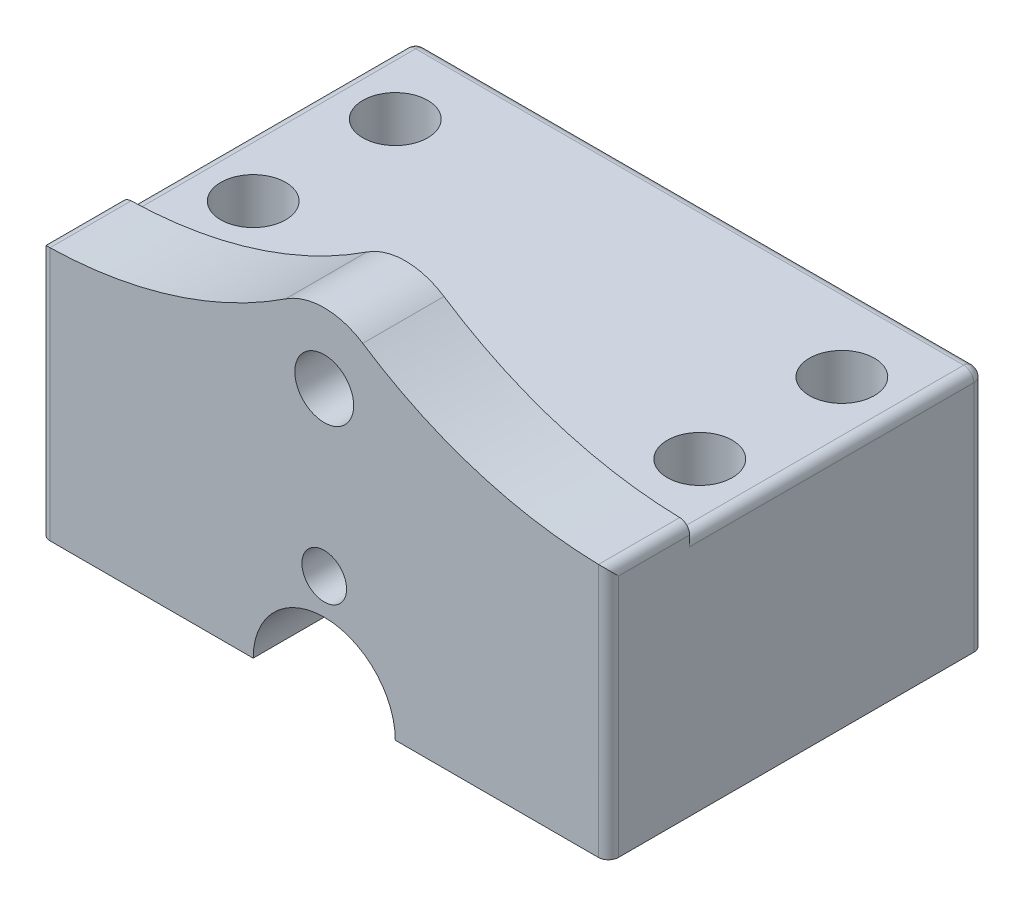
ISO-10303-21;
HEADER;
FILE_DESCRIPTION(('STEP AP214'),'2;1');
FILE_NAME('part.step','',(''),(''),'','','');
FILE_SCHEMA(('AUTOMOTIVE_DESIGN { 1 0 10303 214 1 1 1 1 }'));
ENDSEC;
DATA;
#1=APPLICATION_CONTEXT('core data for automotive mechanical design processes');
#2=APPLICATION_PROTOCOL_DEFINITION('international standard','automotive_design',2000,#1);
#3=PRODUCT_CONTEXT('',#1,'mechanical');
#4=PRODUCT('Part','Part','',(#3));
#5=PRODUCT_RELATED_PRODUCT_CATEGORY('part','',(#4));
#6=PRODUCT_DEFINITION_FORMATION('','',#4);
#7=PRODUCT_DEFINITION_CONTEXT('part definition',#1,'design');
#8=PRODUCT_DEFINITION('design','',#6,#7);
#9=PRODUCT_DEFINITION_SHAPE('','',#8);
#10=(LENGTH_UNIT() NAMED_UNIT(*) SI_UNIT(.MILLI.,.METRE.));
#11=(NAMED_UNIT(*) PLANE_ANGLE_UNIT() SI_UNIT($,.RADIAN.));
#12=(NAMED_UNIT(*) SI_UNIT($,.STERADIAN.) SOLID_ANGLE_UNIT());
#13=UNCERTAINTY_MEASURE_WITH_UNIT(LENGTH_MEASURE(1.E-05),#10,'distance_accuracy_value','');
#14=(GEOMETRIC_REPRESENTATION_CONTEXT(3) GLOBAL_UNCERTAINTY_ASSIGNED_CONTEXT((#13)) GLOBAL_UNIT_ASSIGNED_CONTEXT((#10,
#11,#12)) REPRESENTATION_CONTEXT('',''));
#15=CARTESIAN_POINT('',(0.,0.,0.));
#16=DIRECTION('',(0.,0.,1.));
#17=DIRECTION('',(1.,0.,0.));
#18=AXIS2_PLACEMENT_3D('',#15,#16,#17);
#19=CARTESIAN_POINT('',(-14.,12.,-15.));
#20=DIRECTION('',(0.,1.,0.));
#21=DIRECTION('',(0.,0.,1.));
#22=AXIS2_PLACEMENT_3D('',#19,#20,#21);
#23=PLANE('',#22);
#24=DIRECTION('',(-1.,0.,0.));
#25=VECTOR('',#24,1.);
#26=CARTESIAN_POINT('',(0.,12.,-0.5));
#27=LINE('',#26,#25);
#28=CARTESIAN_POINT('',(13.5,12.,-0.5));
#29=VERTEX_POINT('',#28);
#30=CARTESIAN_POINT('',(-13.5,12.,-0.5));
#31=VERTEX_POINT('',#30);
#32=EDGE_CURVE('E256',#29,#31,#27,.T.);
#33=ORIENTED_EDGE('',*,*,#32,.F.);
#34=DIRECTION('',(0.,0.,1.));
#35=VECTOR('',#34,1.);
#36=CARTESIAN_POINT('',(13.5,12.,-15.));
#37=LINE('',#36,#35);
#38=CARTESIAN_POINT('',(13.5,12.,-14.5));
#39=VERTEX_POINT('',#38);
#40=EDGE_CURVE('E79',#29,#39,#37,.F.);
#41=ORIENTED_EDGE('',*,*,#40,.T.);
#42=DIRECTION('',(-1.,0.,0.));
#43=VECTOR('',#42,1.);
#44=CARTESIAN_POINT('',(-14.,12.,-14.5));
#45=LINE('',#44,#43);
#46=CARTESIAN_POINT('',(-13.5,12.,-14.5));
#47=VERTEX_POINT('',#46);
#48=EDGE_CURVE('E659',#39,#47,#45,.T.);
#49=ORIENTED_EDGE('',*,*,#48,.T.);
#50=DIRECTION('',(0.,0.,1.));
#51=VECTOR('',#50,1.);
#52=CARTESIAN_POINT('',(-13.5,12.,-15.));
#53=LINE('',#52,#51);
#54=EDGE_CURVE('E432',#47,#31,#53,.T.);
#55=ORIENTED_EDGE('',*,*,#54,.T.);
#56=EDGE_LOOP('',(#33,#41,#49,#55));
#57=FACE_BOUND('',#56,.T.);
#58=CARTESIAN_POINT('',(-11.,12.,-11.));
#59=DIRECTION('',(0.,-1.,0.));
#60=DIRECTION('',(0.,0.,-1.));
#61=AXIS2_PLACEMENT_3D('',#58,#59,#60);
#62=CIRCLE('',#61,1.6);
#63=CARTESIAN_POINT('',(-11.,12.,-12.6));
#64=VERTEX_POINT('',#63);
#65=EDGE_CURVE('E308',#64,#64,#62,.T.);
#66=ORIENTED_EDGE('',*,*,#65,.T.);
#67=EDGE_LOOP('',(#66));
#68=FACE_BOUND('',#67,.T.);
#69=CARTESIAN_POINT('',(11.,12.,-4.));
#70=DIRECTION('',(0.,-1.,0.));
#71=DIRECTION('',(0.,0.,-1.));
#72=AXIS2_PLACEMENT_3D('',#69,#70,#71);
#73=CIRCLE('',#72,1.6);
#74=CARTESIAN_POINT('',(11.,12.,-5.59999999999999));
#75=VERTEX_POINT('',#74);
#76=EDGE_CURVE('E332',#75,#75,#73,.T.);
#77=ORIENTED_EDGE('',*,*,#76,.T.);
#78=EDGE_LOOP('',(#77));
#79=FACE_BOUND('',#78,.T.);
#80=CARTESIAN_POINT('',(11.,12.,-11.));
#81=DIRECTION('',(0.,-1.,0.));
#82=DIRECTION('',(0.,0.,-1.));
#83=AXIS2_PLACEMENT_3D('',#80,#81,#82);
#84=CIRCLE('',#83,1.6);
#85=CARTESIAN_POINT('',(11.,12.,-12.6));
#86=VERTEX_POINT('',#85);
#87=EDGE_CURVE('E324',#86,#86,#84,.T.);
#88=ORIENTED_EDGE('',*,*,#87,.T.);
#89=EDGE_LOOP('',(#88));
#90=FACE_BOUND('',#89,.T.);
#91=CARTESIAN_POINT('',(-11.,12.,-4.));
#92=DIRECTION('',(0.,-1.,0.));
#93=DIRECTION('',(0.,0.,-1.));
#94=AXIS2_PLACEMENT_3D('',#91,#92,#93);
#95=CIRCLE('',#94,1.6);
#96=CARTESIAN_POINT('',(-11.,12.,-5.6));
#97=VERTEX_POINT('',#96);
#98=EDGE_CURVE('E316',#97,#97,#95,.T.);
#99=ORIENTED_EDGE('',*,*,#98,.T.);
#100=EDGE_LOOP('',(#99));
#101=FACE_BOUND('',#100,.T.);
#102=ADVANCED_FACE('F53',(#57,#68,#79,#90,#101),#23,.T.);
#103=CARTESIAN_POINT('',(-8.,0.,-15.));
#104=DIRECTION('',(0.,-1.,0.));
#105=DIRECTION('',(1.,0.,0.));
#106=AXIS2_PLACEMENT_3D('',#103,#104,#105);
#107=PLANE('',#106);
#108=DIRECTION('',(0.,0.,-1.));
#109=VECTOR('',#108,1.);
#110=CARTESIAN_POINT('',(-8.1,0.,22.9102597104441));
#111=LINE('',#110,#109);
#112=CARTESIAN_POINT('',(-8.1,0.,0.));
#113=VERTEX_POINT('',#112);
#114=CARTESIAN_POINT('',(-8.1,0.,-15.));
#115=VERTEX_POINT('',#114);
#116=EDGE_CURVE('E71',#113,#115,#111,.T.);
#117=ORIENTED_EDGE('',*,*,#116,.F.);
#118=DIRECTION('',(1.,0.,0.));
#119=VECTOR('',#118,1.);
#120=CARTESIAN_POINT('',(-3.5,0.,0.));
#121=LINE('',#120,#119);
#122=CARTESIAN_POINT('',(-3.5,0.,0.));
#123=VERTEX_POINT('',#122);
#124=EDGE_CURVE('E208',#113,#123,#121,.T.);
#125=ORIENTED_EDGE('',*,*,#124,.T.);
#126=DIRECTION('',(0.,0.,-1.));
#127=VECTOR('',#126,1.);
#128=CARTESIAN_POINT('',(-3.5,0.,3.5));
#129=LINE('',#128,#127);
#130=CARTESIAN_POINT('',(-3.5,0.,3.5));
#131=VERTEX_POINT('',#130);
#132=EDGE_CURVE('E294',#131,#123,#129,.T.);
#133=ORIENTED_EDGE('',*,*,#132,.F.);
#134=DIRECTION('',(1.,0.,0.));
#135=VECTOR('',#134,1.);
#136=CARTESIAN_POINT('',(-3.5,0.,3.5));
#137=LINE('',#136,#135);
#138=CARTESIAN_POINT('',(-13.5,0.,3.5));
#139=VERTEX_POINT('',#138);
#140=EDGE_CURVE('E291',#139,#131,#137,.T.);
#141=ORIENTED_EDGE('',*,*,#140,.F.);
#142=CARTESIAN_POINT('',(-13.5,0.,3.));
#143=DIRECTION('',(0.,-1.,0.));
#144=DIRECTION('',(1.,0.,0.));
#145=AXIS2_PLACEMENT_3D('',#142,#143,#144);
#146=CIRCLE('',#145,0.5);
#147=CARTESIAN_POINT('',(-14.,0.,3.));
#148=VERTEX_POINT('',#147);
#149=EDGE_CURVE('E506',#139,#148,#146,.T.);
#150=ORIENTED_EDGE('',*,*,#149,.T.);
#151=DIRECTION('',(0.,0.,1.));
#152=VECTOR('',#151,1.);
#153=CARTESIAN_POINT('',(-14.,0.,-15.));
#154=LINE('',#153,#152);
#155=CARTESIAN_POINT('',(-14.,0.,-14.5));
#156=VERTEX_POINT('',#155);
#157=EDGE_CURVE('E343',#156,#148,#154,.T.);
#158=ORIENTED_EDGE('',*,*,#157,.F.);
#159=CARTESIAN_POINT('',(-13.5,0.,-14.5));
#160=DIRECTION('',(0.,-1.,0.));
#161=DIRECTION('',(1.,0.,0.));
#162=AXIS2_PLACEMENT_3D('',#159,#160,#161);
#163=CIRCLE('',#162,0.5);
#164=CARTESIAN_POINT('',(-13.5,0.,-15.));
#165=VERTEX_POINT('',#164);
#166=EDGE_CURVE('E400',#156,#165,#163,.T.);
#167=ORIENTED_EDGE('',*,*,#166,.T.);
#168=DIRECTION('',(1.,0.,0.));
#169=VECTOR('',#168,1.);
#170=CARTESIAN_POINT('',(-8.,0.,-15.));
#171=LINE('',#170,#169);
#172=EDGE_CURVE('E338',#165,#115,#171,.T.);
#173=ORIENTED_EDGE('',*,*,#172,.T.);
#174=EDGE_LOOP('',(#117,#125,#133,#141,#150,#158,#167,#173));
#175=FACE_BOUND('',#174,.T.);
#176=CARTESIAN_POINT('',(-11.,0.,-11.));
#177=DIRECTION('',(0.,-1.,0.));
#178=DIRECTION('',(0.,0.,-1.));
#179=AXIS2_PLACEMENT_3D('',#176,#177,#178);
#180=CIRCLE('',#179,1.6);
#181=CARTESIAN_POINT('',(-11.,0.,-12.6));
#182=VERTEX_POINT('',#181);
#183=EDGE_CURVE('E304',#182,#182,#180,.T.);
#184=ORIENTED_EDGE('',*,*,#183,.F.);
#185=EDGE_LOOP('',(#184));
#186=FACE_BOUND('',#185,.T.);
#187=CARTESIAN_POINT('',(-11.,0.,-4.));
#188=DIRECTION('',(0.,-1.,0.));
#189=DIRECTION('',(0.,0.,-1.));
#190=AXIS2_PLACEMENT_3D('',#187,#188,#189);
#191=CIRCLE('',#190,1.6);
#192=CARTESIAN_POINT('',(-11.,0.,-5.6));
#193=VERTEX_POINT('',#192);
#194=EDGE_CURVE('E312',#193,#193,#191,.T.);
#195=ORIENTED_EDGE('',*,*,#194,.F.);
#196=EDGE_LOOP('',(#195));
#197=FACE_BOUND('',#196,.T.);
#198=ADVANCED_FACE('F453',(#175,#186,#197),#107,.T.);
#199=CARTESIAN_POINT('',(-14.,0.,-15.));
#200=DIRECTION('',(-1.,0.,0.));
#201=DIRECTION('',(0.,0.,1.));
#202=AXIS2_PLACEMENT_3D('',#199,#200,#201);
#203=PLANE('',#202);
#204=DIRECTION('',(0.,0.,1.));
#205=VECTOR('',#204,1.);
#206=CARTESIAN_POINT('',(-14.,11.5,-15.));
#207=LINE('',#206,#205);
#208=CARTESIAN_POINT('',(-14.,11.5,-0.5));
#209=VERTEX_POINT('',#208);
#210=CARTESIAN_POINT('',(-14.,11.5,-14.5));
#211=VERTEX_POINT('',#210);
#212=EDGE_CURVE('E519',#209,#211,#207,.F.);
#213=ORIENTED_EDGE('',*,*,#212,.T.);
#214=DIRECTION('',(0.,-1.,0.));
#215=VECTOR('',#214,1.);
#216=CARTESIAN_POINT('',(-14.,0.,-14.5));
#217=LINE('',#216,#215);
#218=EDGE_CURVE('E501',#211,#156,#217,.T.);
#219=ORIENTED_EDGE('',*,*,#218,.T.);
#220=ORIENTED_EDGE('',*,*,#157,.T.);
#221=DIRECTION('',(0.,-1.,0.));
#222=VECTOR('',#221,1.);
#223=CARTESIAN_POINT('',(-14.,0.,3.));
#224=LINE('',#223,#222);
#225=CARTESIAN_POINT('',(-14.,12.0055603614,3.));
#226=VERTEX_POINT('',#225);
#227=EDGE_CURVE('E514',#148,#226,#224,.F.);
#228=ORIENTED_EDGE('',*,*,#227,.T.);
#229=DIRECTION('',(0.,0.,-1.));
#230=VECTOR('',#229,1.);
#231=CARTESIAN_POINT('',(-14.,12.0055603614,-0.5));
#232=LINE('',#231,#230);
#233=CARTESIAN_POINT('',(-14.,12.0055603614,-0.5));
#234=VERTEX_POINT('',#233);
#235=EDGE_CURVE('E509',#226,#234,#232,.T.);
#236=ORIENTED_EDGE('',*,*,#235,.T.);
#237=DIRECTION('',(0.,1.,0.));
#238=VECTOR('',#237,1.);
#239=CARTESIAN_POINT('',(-14.,0.,-0.5));
#240=LINE('',#239,#238);
#241=EDGE_CURVE('E252',#209,#234,#240,.T.);
#242=ORIENTED_EDGE('',*,*,#241,.F.);
#243=EDGE_LOOP('',(#213,#219,#220,#228,#236,#242));
#244=FACE_BOUND('',#243,.T.);
#245=ADVANCED_FACE('F458',(#244),#203,.T.);
#246=CARTESIAN_POINT('',(14.,12.,-15.));
#247=DIRECTION('',(1.,0.,0.));
#248=DIRECTION('',(0.,0.,-1.));
#249=AXIS2_PLACEMENT_3D('',#246,#247,#248);
#250=PLANE('',#249);
#251=DIRECTION('',(0.,0.,1.));
#252=VECTOR('',#251,1.);
#253=CARTESIAN_POINT('',(14.,0.,-15.));
#254=LINE('',#253,#252);
#255=CARTESIAN_POINT('',(14.,0.,-14.5));
#256=VERTEX_POINT('',#255);
#257=CARTESIAN_POINT('',(14.,0.,3.));
#258=VERTEX_POINT('',#257);
#259=EDGE_CURVE('E342',#256,#258,#254,.T.);
#260=ORIENTED_EDGE('',*,*,#259,.F.);
#261=DIRECTION('',(0.,1.,0.));
#262=VECTOR('',#261,1.);
#263=CARTESIAN_POINT('',(14.,12.,-14.5));
#264=LINE('',#263,#262);
#265=CARTESIAN_POINT('',(14.,11.5,-14.5));
#266=VERTEX_POINT('',#265);
#267=EDGE_CURVE('E360',#256,#266,#264,.T.);
#268=ORIENTED_EDGE('',*,*,#267,.T.);
#269=DIRECTION('',(0.,0.,1.));
#270=VECTOR('',#269,1.);
#271=CARTESIAN_POINT('',(14.,11.5,-15.));
#272=LINE('',#271,#270);
#273=CARTESIAN_POINT('',(14.,11.5,-0.5));
#274=VERTEX_POINT('',#273);
#275=EDGE_CURVE('E356',#266,#274,#272,.T.);
#276=ORIENTED_EDGE('',*,*,#275,.T.);
#277=DIRECTION('',(0.,1.,0.));
#278=VECTOR('',#277,1.);
#279=CARTESIAN_POINT('',(14.,0.,-0.5));
#280=LINE('',#279,#278);
#281=CARTESIAN_POINT('',(14.,12.0055603614,-0.5));
#282=VERTEX_POINT('',#281);
#283=EDGE_CURVE('E237',#274,#282,#280,.T.);
#284=ORIENTED_EDGE('',*,*,#283,.T.);
#285=DIRECTION('',(0.,0.,1.));
#286=VECTOR('',#285,1.);
#287=CARTESIAN_POINT('',(14.,12.0055603614,-15.));
#288=LINE('',#287,#286);
#289=CARTESIAN_POINT('',(14.,12.0055603614,3.));
#290=VERTEX_POINT('',#289);
#291=EDGE_CURVE('E347',#282,#290,#288,.T.);
#292=ORIENTED_EDGE('',*,*,#291,.T.);
#293=DIRECTION('',(0.,1.,0.));
#294=VECTOR('',#293,1.);
#295=CARTESIAN_POINT('',(14.,12.,3.));
#296=LINE('',#295,#294);
#297=EDGE_CURVE('E353',#290,#258,#296,.F.);
#298=ORIENTED_EDGE('',*,*,#297,.T.);
#299=EDGE_LOOP('',(#260,#268,#276,#284,#292,#298));
#300=FACE_BOUND('',#299,.T.);
#301=ADVANCED_FACE('F464',(#300),#250,.T.);
#302=CARTESIAN_POINT('',(14.,0.,-15.));
#303=DIRECTION('',(0.,-1.,0.));
#304=DIRECTION('',(1.,0.,0.));
#305=AXIS2_PLACEMENT_3D('',#302,#303,#304);
#306=PLANE('',#305);
#307=DIRECTION('',(1.,0.,0.));
#308=VECTOR('',#307,1.);
#309=CARTESIAN_POINT('',(14.,0.,0.));
#310=LINE('',#309,#308);
#311=CARTESIAN_POINT('',(3.5,0.,0.));
#312=VERTEX_POINT('',#311);
#313=CARTESIAN_POINT('',(8.1,0.,0.));
#314=VERTEX_POINT('',#313);
#315=EDGE_CURVE('E195',#312,#314,#310,.T.);
#316=ORIENTED_EDGE('',*,*,#315,.T.);
#317=DIRECTION('',(0.,0.,-1.));
#318=VECTOR('',#317,1.);
#319=CARTESIAN_POINT('',(8.1,0.,22.9102597104441));
#320=LINE('',#319,#318);
#321=CARTESIAN_POINT('',(8.1,0.,-15.));
#322=VERTEX_POINT('',#321);
#323=EDGE_CURVE('E199',#322,#314,#320,.F.);
#324=ORIENTED_EDGE('',*,*,#323,.F.);
#325=DIRECTION('',(1.,0.,0.));
#326=VECTOR('',#325,1.);
#327=CARTESIAN_POINT('',(14.,0.,-15.));
#328=LINE('',#327,#326);
#329=CARTESIAN_POINT('',(13.5,0.,-15.));
#330=VERTEX_POINT('',#329);
#331=EDGE_CURVE('E336',#322,#330,#328,.T.);
#332=ORIENTED_EDGE('',*,*,#331,.T.);
#333=CARTESIAN_POINT('',(13.5,0.,-14.5));
#334=DIRECTION('',(0.,-1.,0.));
#335=DIRECTION('',(1.,0.,0.));
#336=AXIS2_PLACEMENT_3D('',#333,#334,#335);
#337=CIRCLE('',#336,0.5);
#338=EDGE_CURVE('E377',#330,#256,#337,.T.);
#339=ORIENTED_EDGE('',*,*,#338,.T.);
#340=ORIENTED_EDGE('',*,*,#259,.T.);
#341=CARTESIAN_POINT('',(13.5,0.,3.));
#342=DIRECTION('',(0.,-1.,0.));
#343=DIRECTION('',(1.,0.,0.));
#344=AXIS2_PLACEMENT_3D('',#341,#342,#343);
#345=CIRCLE('',#344,0.5);
#346=CARTESIAN_POINT('',(13.5,0.,3.5));
#347=VERTEX_POINT('',#346);
#348=EDGE_CURVE('E374',#258,#347,#345,.T.);
#349=ORIENTED_EDGE('',*,*,#348,.T.);
#350=DIRECTION('',(1.,0.,0.));
#351=VECTOR('',#350,1.);
#352=CARTESIAN_POINT('',(14.,0.,3.5));
#353=LINE('',#352,#351);
#354=CARTESIAN_POINT('',(3.5,0.,3.5));
#355=VERTEX_POINT('',#354);
#356=EDGE_CURVE('E287',#355,#347,#353,.T.);
#357=ORIENTED_EDGE('',*,*,#356,.F.);
#358=DIRECTION('',(0.,0.,-1.));
#359=VECTOR('',#358,1.);
#360=CARTESIAN_POINT('',(3.5,0.,3.5));
#361=LINE('',#360,#359);
#362=EDGE_CURVE('E202',#355,#312,#361,.T.);
#363=ORIENTED_EDGE('',*,*,#362,.T.);
#364=EDGE_LOOP('',(#316,#324,#332,#339,#340,#349,#357,#363));
#365=FACE_BOUND('',#364,.T.);
#366=CARTESIAN_POINT('',(11.,0.,-11.));
#367=DIRECTION('',(0.,-1.,0.));
#368=DIRECTION('',(0.,0.,-1.));
#369=AXIS2_PLACEMENT_3D('',#366,#367,#368);
#370=CIRCLE('',#369,1.6);
#371=CARTESIAN_POINT('',(11.,0.,-12.6));
#372=VERTEX_POINT('',#371);
#373=EDGE_CURVE('E320',#372,#372,#370,.T.);
#374=ORIENTED_EDGE('',*,*,#373,.F.);
#375=EDGE_LOOP('',(#374));
#376=FACE_BOUND('',#375,.T.);
#377=CARTESIAN_POINT('',(11.,0.,-4.));
#378=DIRECTION('',(0.,-1.,0.));
#379=DIRECTION('',(0.,0.,-1.));
#380=AXIS2_PLACEMENT_3D('',#377,#378,#379);
#381=CIRCLE('',#380,1.6);
#382=CARTESIAN_POINT('',(11.,0.,-5.6));
#383=VERTEX_POINT('',#382);
#384=EDGE_CURVE('E328',#383,#383,#381,.T.);
#385=ORIENTED_EDGE('',*,*,#384,.F.);
#386=EDGE_LOOP('',(#385));
#387=FACE_BOUND('',#386,.T.);
#388=ADVANCED_FACE('F197',(#365,#376,#387),#306,.T.);
#389=CARTESIAN_POINT('',(0.,0.,-15.));
#390=DIRECTION('',(0.,0.,1.));
#391=DIRECTION('',(1.,0.,0.));
#392=AXIS2_PLACEMENT_3D('',#389,#390,#391);
#393=PLANE('',#392);
#394=ORIENTED_EDGE('',*,*,#331,.F.);
#395=CARTESIAN_POINT('',(0.,0.,-15.));
#396=DIRECTION('',(0.,0.,-1.));
#397=DIRECTION('',(-1.,0.,0.));
#398=AXIS2_PLACEMENT_3D('',#395,#396,#397);
#399=CIRCLE('',#398,8.1);
#400=EDGE_CURVE('E213',#115,#322,#399,.T.);
#401=ORIENTED_EDGE('',*,*,#400,.F.);
#402=ORIENTED_EDGE('',*,*,#172,.F.);
#403=DIRECTION('',(0.,-1.,0.));
#404=VECTOR('',#403,1.);
#405=CARTESIAN_POINT('',(-13.5,12.,-15.));
#406=LINE('',#405,#404);
#407=CARTESIAN_POINT('',(-13.5,11.5,-15.));
#408=VERTEX_POINT('',#407);
#409=EDGE_CURVE('E367',#165,#408,#406,.F.);
#410=ORIENTED_EDGE('',*,*,#409,.T.);
#411=DIRECTION('',(-1.,0.,0.));
#412=VECTOR('',#411,1.);
#413=CARTESIAN_POINT('',(14.,11.5,-15.));
#414=LINE('',#413,#412);
#415=CARTESIAN_POINT('',(13.5,11.5,-15.));
#416=VERTEX_POINT('',#415);
#417=EDGE_CURVE('E364',#408,#416,#414,.F.);
#418=ORIENTED_EDGE('',*,*,#417,.T.);
#419=DIRECTION('',(0.,1.,0.));
#420=VECTOR('',#419,1.);
#421=CARTESIAN_POINT('',(13.5,0.,-15.));
#422=LINE('',#421,#420);
#423=EDGE_CURVE('E370',#416,#330,#422,.F.);
#424=ORIENTED_EDGE('',*,*,#423,.T.);
#425=EDGE_LOOP('',(#394,#401,#402,#410,#418,#424));
#426=FACE_BOUND('',#425,.T.);
#427=ADVANCED_FACE('F470',(#426),#393,.F.);
#428=CARTESIAN_POINT('',(11.,0.,-4.));
#429=DIRECTION('',(0.,-1.,0.));
#430=DIRECTION('',(0.,0.,-1.));
#431=AXIS2_PLACEMENT_3D('',#428,#429,#430);
#432=CYLINDRICAL_SURFACE('',#431,1.6);
#433=ORIENTED_EDGE('',*,*,#76,.F.);
#434=EDGE_LOOP('',(#433));
#435=FACE_BOUND('',#434,.T.);
#436=ORIENTED_EDGE('',*,*,#384,.T.);
#437=EDGE_LOOP('',(#436));
#438=FACE_BOUND('',#437,.T.);
#439=ADVANCED_FACE('F682',(#435,#438),#432,.F.);
#440=CARTESIAN_POINT('',(11.,0.,-11.));
#441=DIRECTION('',(0.,-1.,0.));
#442=DIRECTION('',(0.,0.,-1.));
#443=AXIS2_PLACEMENT_3D('',#440,#441,#442);
#444=CYLINDRICAL_SURFACE('',#443,1.6);
#445=ORIENTED_EDGE('',*,*,#87,.F.);
#446=EDGE_LOOP('',(#445));
#447=FACE_BOUND('',#446,.T.);
#448=ORIENTED_EDGE('',*,*,#373,.T.);
#449=EDGE_LOOP('',(#448));
#450=FACE_BOUND('',#449,.T.);
#451=ADVANCED_FACE('F689',(#447,#450),#444,.F.);
#452=CARTESIAN_POINT('',(-11.,0.,-4.));
#453=DIRECTION('',(0.,-1.,0.));
#454=DIRECTION('',(0.,0.,-1.));
#455=AXIS2_PLACEMENT_3D('',#452,#453,#454);
#456=CYLINDRICAL_SURFACE('',#455,1.6);
#457=ORIENTED_EDGE('',*,*,#98,.F.);
#458=EDGE_LOOP('',(#457));
#459=FACE_BOUND('',#458,.T.);
#460=ORIENTED_EDGE('',*,*,#194,.T.);
#461=EDGE_LOOP('',(#460));
#462=FACE_BOUND('',#461,.T.);
#463=ADVANCED_FACE('F696',(#459,#462),#456,.F.);
#464=CARTESIAN_POINT('',(-11.,0.,-11.));
#465=DIRECTION('',(0.,-1.,0.));
#466=DIRECTION('',(0.,0.,-1.));
#467=AXIS2_PLACEMENT_3D('',#464,#465,#466);
#468=CYLINDRICAL_SURFACE('',#467,1.6);
#469=ORIENTED_EDGE('',*,*,#65,.F.);
#470=EDGE_LOOP('',(#469));
#471=FACE_BOUND('',#470,.T.);
#472=ORIENTED_EDGE('',*,*,#183,.T.);
#473=EDGE_LOOP('',(#472));
#474=FACE_BOUND('',#473,.T.);
#475=ADVANCED_FACE('F703',(#471,#474),#468,.F.);
#476=CARTESIAN_POINT('',(0.,0.,0.));
#477=DIRECTION('',(0.,0.,1.));
#478=DIRECTION('',(1.,0.,0.));
#479=AXIS2_PLACEMENT_3D('',#476,#477,#478);
#480=PLANE('',#479);
#481=CARTESIAN_POINT('',(0.,5.25,0.));
#482=DIRECTION('',(0.,0.,1.));
#483=DIRECTION('',(1.,0.,0.));
#484=AXIS2_PLACEMENT_3D('',#481,#482,#483);
#485=CIRCLE('',#484,1.09999999999999);
#486=CARTESIAN_POINT('',(1.09999999999999,5.25,0.));
#487=VERTEX_POINT('',#486);
#488=EDGE_CURVE('E279',#487,#487,#485,.T.);
#489=ORIENTED_EDGE('',*,*,#488,.T.);
#490=EDGE_LOOP('',(#489));
#491=FACE_BOUND('',#490,.T.);
#492=ORIENTED_EDGE('',*,*,#124,.F.);
#493=CARTESIAN_POINT('',(0.,0.,0.));
#494=DIRECTION('',(0.,0.,1.));
#495=DIRECTION('',(1.,0.,0.));
#496=AXIS2_PLACEMENT_3D('',#493,#494,#495);
#497=CIRCLE('',#496,8.1);
#498=EDGE_CURVE('E212',#113,#314,#497,.F.);
#499=ORIENTED_EDGE('',*,*,#498,.T.);
#500=ORIENTED_EDGE('',*,*,#315,.F.);
#501=CARTESIAN_POINT('',(0.,0.,0.));
#502=DIRECTION('',(0.,0.,-1.));
#503=DIRECTION('',(1.,0.,0.));
#504=AXIS2_PLACEMENT_3D('',#501,#502,#503);
#505=CIRCLE('',#504,3.5);
#506=EDGE_CURVE('E209',#123,#312,#505,.T.);
#507=ORIENTED_EDGE('',*,*,#506,.F.);
#508=EDGE_LOOP('',(#492,#499,#500,#507));
#509=FACE_BOUND('',#508,.T.);
#510=ADVANCED_FACE('F216',(#491,#509),#480,.F.);
#511=CARTESIAN_POINT('',(0.,0.,3.5));
#512=DIRECTION('',(0.,0.,-1.));
#513=DIRECTION('',(-1.,0.,0.));
#514=AXIS2_PLACEMENT_3D('',#511,#512,#513);
#515=CYLINDRICAL_SURFACE('',#514,3.5);
#516=ORIENTED_EDGE('',*,*,#506,.T.);
#517=ORIENTED_EDGE('',*,*,#362,.F.);
#518=CARTESIAN_POINT('',(0.,0.,3.5));
#519=DIRECTION('',(0.,0.,-1.));
#520=DIRECTION('',(1.,0.,0.));
#521=AXIS2_PLACEMENT_3D('',#518,#519,#520);
#522=CIRCLE('',#521,3.5);
#523=EDGE_CURVE('E283',#131,#355,#522,.T.);
#524=ORIENTED_EDGE('',*,*,#523,.F.);
#525=ORIENTED_EDGE('',*,*,#132,.T.);
#526=EDGE_LOOP('',(#516,#517,#524,#525));
#527=FACE_BOUND('',#526,.T.);
#528=ADVANCED_FACE('F546',(#527),#515,.F.);
#529=CARTESIAN_POINT('',(0.,0.,3.5));
#530=DIRECTION('',(0.,0.,1.));
#531=DIRECTION('',(1.,0.,0.));
#532=AXIS2_PLACEMENT_3D('',#529,#530,#531);
#533=PLANE('',#532);
#534=CARTESIAN_POINT('',(0.,13.25,3.5));
#535=DIRECTION('',(0.,0.,1.));
#536=DIRECTION('',(1.,0.,0.));
#537=AXIS2_PLACEMENT_3D('',#534,#535,#536);
#538=CIRCLE('',#537,1.45);
#539=CARTESIAN_POINT('',(1.45,13.25,3.5));
#540=VERTEX_POINT('',#539);
#541=EDGE_CURVE('E227',#540,#540,#538,.T.);
#542=ORIENTED_EDGE('',*,*,#541,.F.);
#543=EDGE_LOOP('',(#542));
#544=FACE_BOUND('',#543,.T.);
#545=CARTESIAN_POINT('',(0.,5.25,3.5));
#546=DIRECTION('',(0.,0.,1.));
#547=DIRECTION('',(1.,0.,0.));
#548=AXIS2_PLACEMENT_3D('',#545,#546,#547);
#549=CIRCLE('',#548,1.09999999999999);
#550=CARTESIAN_POINT('',(1.09999999999999,5.25,3.5));
#551=VERTEX_POINT('',#550);
#552=EDGE_CURVE('E273',#551,#551,#549,.T.);
#553=ORIENTED_EDGE('',*,*,#552,.F.);
#554=EDGE_LOOP('',(#553));
#555=FACE_BOUND('',#554,.T.);
#556=ORIENTED_EDGE('',*,*,#356,.T.);
#557=DIRECTION('',(0.,1.,0.));
#558=VECTOR('',#557,1.);
#559=CARTESIAN_POINT('',(13.5,0.,3.5));
#560=LINE('',#559,#558);
#561=CARTESIAN_POINT('',(13.5,12.5056868614191,3.5));
#562=VERTEX_POINT('',#561);
#563=EDGE_CURVE('E384',#347,#562,#560,.T.);
#564=ORIENTED_EDGE('',*,*,#563,.T.);
#565=CARTESIAN_POINT('',(14.,34.4833333333333,3.5));
#566=DIRECTION('',(0.,0.,1.));
#567=DIRECTION('',(1.,0.,0.));
#568=AXIS2_PLACEMENT_3D('',#565,#566,#567);
#569=CIRCLE('',#568,21.9833333333333);
#570=CARTESIAN_POINT('',(1.89908256880734,16.1302752293578,3.5));
#571=VERTEX_POINT('',#570);
#572=EDGE_CURVE('E236',#562,#571,#569,.F.);
#573=ORIENTED_EDGE('',*,*,#572,.T.);
#574=CARTESIAN_POINT('',(0.,13.25,3.5));
#575=DIRECTION('',(0.,0.,1.));
#576=DIRECTION('',(1.,0.,0.));
#577=AXIS2_PLACEMENT_3D('',#574,#575,#576);
#578=CIRCLE('',#577,3.45);
#579=CARTESIAN_POINT('',(-1.89908256880734,16.1302752293578,3.5));
#580=VERTEX_POINT('',#579);
#581=EDGE_CURVE('E263',#571,#580,#578,.T.);
#582=ORIENTED_EDGE('',*,*,#581,.T.);
#583=CARTESIAN_POINT('',(-14.,34.4833333333333,3.5));
#584=DIRECTION('',(0.,0.,1.));
#585=DIRECTION('',(1.,0.,0.));
#586=AXIS2_PLACEMENT_3D('',#583,#584,#585);
#587=CIRCLE('',#586,21.9833333333333);
#588=CARTESIAN_POINT('',(-13.5,12.5056868614191,3.5));
#589=VERTEX_POINT('',#588);
#590=EDGE_CURVE('E242',#589,#580,#587,.T.);
#591=ORIENTED_EDGE('',*,*,#590,.F.);
#592=DIRECTION('',(0.,-1.,0.));
#593=VECTOR('',#592,1.);
#594=CARTESIAN_POINT('',(-13.5,0.,3.5));
#595=LINE('',#594,#593);
#596=EDGE_CURVE('E380',#589,#139,#595,.T.);
#597=ORIENTED_EDGE('',*,*,#596,.T.);
#598=ORIENTED_EDGE('',*,*,#140,.T.);
#599=ORIENTED_EDGE('',*,*,#523,.T.);
#600=EDGE_LOOP('',(#556,#564,#573,#582,#591,#597,#598,#599));
#601=FACE_BOUND('',#600,.T.);
#602=ADVANCED_FACE('F541',(#544,#555,#601),#533,.T.);
#603=CARTESIAN_POINT('',(0.,5.25,3.5));
#604=DIRECTION('',(0.,0.,1.));
#605=DIRECTION('',(1.,0.,0.));
#606=AXIS2_PLACEMENT_3D('',#603,#604,#605);
#607=CYLINDRICAL_SURFACE('',#606,1.09999999999999);
#608=ORIENTED_EDGE('',*,*,#552,.T.);
#609=EDGE_LOOP('',(#608));
#610=FACE_BOUND('',#609,.T.);
#611=ORIENTED_EDGE('',*,*,#488,.F.);
#612=EDGE_LOOP('',(#611));
#613=FACE_BOUND('',#612,.T.);
#614=ADVANCED_FACE('F441',(#610,#613),#607,.F.);
#615=CARTESIAN_POINT('',(-14.,34.4833333333333,-0.5));
#616=DIRECTION('',(0.,0.,1.));
#617=DIRECTION('',(1.,0.,0.));
#618=AXIS2_PLACEMENT_3D('',#615,#616,#617);
#619=CYLINDRICAL_SURFACE('',#618,21.9833333333333);
#620=DIRECTION('',(0.,0.,1.));
#621=VECTOR('',#620,1.);
#622=CARTESIAN_POINT('',(-13.5111193476649,12.5054367062169,-0.5));
#623=LINE('',#622,#621);
#624=CARTESIAN_POINT('',(-13.5111193476649,12.5054367062169,-0.5));
#625=VERTEX_POINT('',#624);
#626=CARTESIAN_POINT('',(-13.5111193476649,12.5054367062169,3.4998763448169));
#627=VERTEX_POINT('',#626);
#628=EDGE_CURVE('E433',#625,#627,#623,.T.);
#629=ORIENTED_EDGE('',*,*,#628,.T.);
#630=CARTESIAN_POINT('',(-13.5111193476649,12.5054367062169,3.4998763448169));
#631=CARTESIAN_POINT('',(-13.5092663415747,12.5054779247906,3.49991756269268));
#632=CARTESIAN_POINT('',(-13.5074132262242,12.5055193803443,3.49994847622917));
#633=CARTESIAN_POINT('',(-13.5037067770025,12.5056027654117,3.49998969462353));
#634=CARTESIAN_POINT('',(-13.5018534431314,12.5056446949254,3.49999999948142));
#635=CARTESIAN_POINT('',(-13.5,12.5056868614191,3.5));
#636=B_SPLINE_CURVE_WITH_KNOTS('',3,(#630,#631,#632,#633,#634,#635),.UNSPECIFIED.,.F.,.F.,(4,2,
4),(0.,0.00556151026326086,0.011123020526523),.UNSPECIFIED.);
#637=EDGE_CURVE('E423',#627,#589,#636,.T.);
#638=ORIENTED_EDGE('',*,*,#637,.T.);
#639=ORIENTED_EDGE('',*,*,#590,.T.);
#640=DIRECTION('',(0.,0.,1.));
#641=VECTOR('',#640,1.);
#642=CARTESIAN_POINT('',(-1.89908256880734,16.1302752293578,-0.5));
#643=LINE('',#642,#641);
#644=CARTESIAN_POINT('',(-1.89908256880734,16.1302752293578,-0.5));
#645=VERTEX_POINT('',#644);
#646=EDGE_CURVE('E269',#645,#580,#643,.T.);
#647=ORIENTED_EDGE('',*,*,#646,.F.);
#648=CARTESIAN_POINT('',(-14.,34.4833333333333,-0.5));
#649=DIRECTION('',(0.,0.,1.));
#650=DIRECTION('',(1.,0.,0.));
#651=AXIS2_PLACEMENT_3D('',#648,#649,#650);
#652=CIRCLE('',#651,21.9833333333333);
#653=EDGE_CURVE('E249',#625,#645,#652,.T.);
#654=ORIENTED_EDGE('',*,*,#653,.F.);
#655=EDGE_LOOP('',(#629,#638,#639,#647,#654));
#656=FACE_BOUND('',#655,.T.);
#657=ADVANCED_FACE('F436',(#656),#619,.F.);
#658=CARTESIAN_POINT('',(0.,13.25,-0.5));
#659=DIRECTION('',(0.,0.,1.));
#660=DIRECTION('',(1.,0.,0.));
#661=AXIS2_PLACEMENT_3D('',#658,#659,#660);
#662=CYLINDRICAL_SURFACE('',#661,3.45);
#663=ORIENTED_EDGE('',*,*,#581,.F.);
#664=DIRECTION('',(0.,0.,1.));
#665=VECTOR('',#664,1.);
#666=CARTESIAN_POINT('',(1.89908256880734,16.1302752293578,-0.5));
#667=LINE('',#666,#665);
#668=CARTESIAN_POINT('',(1.89908256880734,16.1302752293578,-0.5));
#669=VERTEX_POINT('',#668);
#670=EDGE_CURVE('E260',#669,#571,#667,.T.);
#671=ORIENTED_EDGE('',*,*,#670,.F.);
#672=CARTESIAN_POINT('',(0.,13.25,-0.5));
#673=DIRECTION('',(0.,0.,1.));
#674=DIRECTION('',(1.,0.,0.));
#675=AXIS2_PLACEMENT_3D('',#672,#673,#674);
#676=CIRCLE('',#675,3.45);
#677=EDGE_CURVE('E245',#669,#645,#676,.T.);
#678=ORIENTED_EDGE('',*,*,#677,.T.);
#679=ORIENTED_EDGE('',*,*,#646,.T.);
#680=EDGE_LOOP('',(#663,#671,#678,#679));
#681=FACE_BOUND('',#680,.T.);
#682=ADVANCED_FACE('F440',(#681),#662,.T.);
#683=CARTESIAN_POINT('',(14.,34.4833333333333,-0.5));
#684=DIRECTION('',(0.,0.,1.));
#685=DIRECTION('',(1.,0.,0.));
#686=AXIS2_PLACEMENT_3D('',#683,#684,#685);
#687=CYLINDRICAL_SURFACE('',#686,21.9833333333333);
#688=ORIENTED_EDGE('',*,*,#572,.F.);
#689=CARTESIAN_POINT('',(13.5,12.5056868614191,3.5));
#690=CARTESIAN_POINT('',(13.5018534431314,12.5056446949254,3.49999999948142));
#691=CARTESIAN_POINT('',(13.5037067770025,12.5056027654117,3.49998969462353));
#692=CARTESIAN_POINT('',(13.5074132262242,12.5055193803443,3.49994847622917));
#693=CARTESIAN_POINT('',(13.5092663415747,12.5054779247906,3.49991756269268));
#694=CARTESIAN_POINT('',(13.5111193476649,12.5054367062169,3.4998763448169));
#695=B_SPLINE_CURVE_WITH_KNOTS('',3,(#689,#690,#691,#692,#693,#694),.UNSPECIFIED.,.F.,.F.,(4,2,
4),(0.,0.00556151026326217,0.011123020526523),.UNSPECIFIED.);
#696=CARTESIAN_POINT('',(13.5111193476649,12.5054367062169,3.4998763448169));
#697=VERTEX_POINT('',#696);
#698=EDGE_CURVE('E391',#562,#697,#695,.T.);
#699=ORIENTED_EDGE('',*,*,#698,.T.);
#700=DIRECTION('',(0.,0.,1.));
#701=VECTOR('',#700,1.);
#702=CARTESIAN_POINT('',(13.5111193476649,12.5054367062169,-0.5));
#703=LINE('',#702,#701);
#704=CARTESIAN_POINT('',(13.5111193476649,12.5054367062169,-0.5));
#705=VERTEX_POINT('',#704);
#706=EDGE_CURVE('E388',#697,#705,#703,.F.);
#707=ORIENTED_EDGE('',*,*,#706,.T.);
#708=CARTESIAN_POINT('',(14.,34.4833333333333,-0.5));
#709=DIRECTION('',(0.,0.,1.));
#710=DIRECTION('',(1.,0.,0.));
#711=AXIS2_PLACEMENT_3D('',#708,#709,#710);
#712=CIRCLE('',#711,21.9833333333333);
#713=EDGE_CURVE('E241',#705,#669,#712,.F.);
#714=ORIENTED_EDGE('',*,*,#713,.T.);
#715=ORIENTED_EDGE('',*,*,#670,.T.);
#716=EDGE_LOOP('',(#688,#699,#707,#714,#715));
#717=FACE_BOUND('',#716,.T.);
#718=ADVANCED_FACE('F402',(#717),#687,.F.);
#719=CARTESIAN_POINT('',(0.,0.,-0.5));
#720=DIRECTION('',(0.,0.,1.));
#721=DIRECTION('',(1.,0.,0.));
#722=AXIS2_PLACEMENT_3D('',#719,#720,#721);
#723=PLANE('',#722);
#724=ORIENTED_EDGE('',*,*,#713,.F.);
#725=CARTESIAN_POINT('',(13.5,12.0055603614,-0.5));
#726=DIRECTION('',(0.,0.,1.));
#727=DIRECTION('',(1.,0.,0.));
#728=AXIS2_PLACEMENT_3D('',#725,#726,#727);
#729=CIRCLE('',#728,0.5);
#730=EDGE_CURVE('E557',#705,#282,#729,.F.);
#731=ORIENTED_EDGE('',*,*,#730,.T.);
#732=ORIENTED_EDGE('',*,*,#283,.F.);
#733=CARTESIAN_POINT('',(13.5,11.5,-0.5));
#734=DIRECTION('',(0.,0.,1.));
#735=DIRECTION('',(1.,0.,0.));
#736=AXIS2_PLACEMENT_3D('',#733,#734,#735);
#737=CIRCLE('',#736,0.5);
#738=EDGE_CURVE('E63',#274,#29,#737,.T.);
#739=ORIENTED_EDGE('',*,*,#738,.T.);
#740=ORIENTED_EDGE('',*,*,#32,.T.);
#741=CARTESIAN_POINT('',(-13.5,11.5,-0.5));
#742=DIRECTION('',(0.,0.,1.));
#743=DIRECTION('',(1.,0.,0.));
#744=AXIS2_PLACEMENT_3D('',#741,#742,#743);
#745=CIRCLE('',#744,0.5);
#746=EDGE_CURVE('E12',#31,#209,#745,.T.);
#747=ORIENTED_EDGE('',*,*,#746,.T.);
#748=ORIENTED_EDGE('',*,*,#241,.T.);
#749=CARTESIAN_POINT('',(-13.5,12.0055603614,-0.5));
#750=DIRECTION('',(0.,0.,1.));
#751=DIRECTION('',(1.,0.,0.));
#752=AXIS2_PLACEMENT_3D('',#749,#750,#751);
#753=CIRCLE('',#752,0.5);
#754=EDGE_CURVE('E560',#234,#625,#753,.F.);
#755=ORIENTED_EDGE('',*,*,#754,.T.);
#756=ORIENTED_EDGE('',*,*,#653,.T.);
#757=ORIENTED_EDGE('',*,*,#677,.F.);
#758=EDGE_LOOP('',(#724,#731,#732,#739,#740,#747,#748,#755,#756,#757));
#759=FACE_BOUND('',#758,.T.);
#760=ADVANCED_FACE('F443',(#759),#723,.F.);
#761=CARTESIAN_POINT('',(0.,13.25,-4.60121933088197));
#762=DIRECTION('',(0.,0.,1.));
#763=DIRECTION('',(1.,0.,0.));
#764=AXIS2_PLACEMENT_3D('',#761,#762,#763);
#765=CYLINDRICAL_SURFACE('',#764,1.45);
#766=CARTESIAN_POINT('',(0.,13.25,0.5));
#767=DIRECTION('',(0.,0.,1.));
#768=DIRECTION('',(1.,0.,0.));
#769=AXIS2_PLACEMENT_3D('',#766,#767,#768);
#770=CIRCLE('',#769,1.45);
#771=CARTESIAN_POINT('',(1.45,13.25,0.5));
#772=VERTEX_POINT('',#771);
#773=EDGE_CURVE('E231',#772,#772,#770,.F.);
#774=ORIENTED_EDGE('',*,*,#773,.T.);
#775=EDGE_LOOP('',(#774));
#776=FACE_BOUND('',#775,.T.);
#777=ORIENTED_EDGE('',*,*,#541,.T.);
#778=EDGE_LOOP('',(#777));
#779=FACE_BOUND('',#778,.T.);
#780=ADVANCED_FACE('F753',(#776,#779),#765,.F.);
#781=CARTESIAN_POINT('',(0.,0.,0.5));
#782=DIRECTION('',(0.,0.,1.));
#783=DIRECTION('',(1.,0.,0.));
#784=AXIS2_PLACEMENT_3D('',#781,#782,#783);
#785=PLANE('',#784);
#786=ORIENTED_EDGE('',*,*,#773,.F.);
#787=EDGE_LOOP('',(#786));
#788=FACE_BOUND('',#787,.T.);
#789=ADVANCED_FACE('F495',(#788),#785,.T.);
#790=CARTESIAN_POINT('',(-13.5,11.5,-15.));
#791=DIRECTION('',(0.,0.,1.));
#792=DIRECTION('',(1.,0.,0.));
#793=AXIS2_PLACEMENT_3D('',#790,#791,#792);
#794=CYLINDRICAL_SURFACE('',#793,0.5);
#795=ORIENTED_EDGE('',*,*,#746,.F.);
#796=ORIENTED_EDGE('',*,*,#54,.F.);
#797=CARTESIAN_POINT('',(-13.5,11.5,-14.5));
#798=DIRECTION('',(0.,0.,-1.));
#799=DIRECTION('',(-1.,0.,0.));
#800=AXIS2_PLACEMENT_3D('',#797,#798,#799);
#801=CIRCLE('',#800,0.5);
#802=EDGE_CURVE('E232',#211,#47,#801,.T.);
#803=ORIENTED_EDGE('',*,*,#802,.F.);
#804=ORIENTED_EDGE('',*,*,#212,.F.);
#805=EDGE_LOOP('',(#795,#796,#803,#804));
#806=FACE_BOUND('',#805,.T.);
#807=ADVANCED_FACE('F413',(#806),#794,.T.);
#808=CARTESIAN_POINT('',(-13.5,0.,-14.5));
#809=DIRECTION('',(0.,1.,0.));
#810=DIRECTION('',(0.,0.,1.));
#811=AXIS2_PLACEMENT_3D('',#808,#809,#810);
#812=CYLINDRICAL_SURFACE('',#811,0.5);
#813=ORIENTED_EDGE('',*,*,#166,.F.);
#814=ORIENTED_EDGE('',*,*,#218,.F.);
#815=CARTESIAN_POINT('',(-13.5,11.5,-14.5));
#816=DIRECTION('',(0.,1.,0.));
#817=DIRECTION('',(0.,0.,1.));
#818=AXIS2_PLACEMENT_3D('',#815,#816,#817);
#819=CIRCLE('',#818,0.5);
#820=EDGE_CURVE('E584',#408,#211,#819,.T.);
#821=ORIENTED_EDGE('',*,*,#820,.F.);
#822=ORIENTED_EDGE('',*,*,#409,.F.);
#823=EDGE_LOOP('',(#813,#814,#821,#822));
#824=FACE_BOUND('',#823,.T.);
#825=ADVANCED_FACE('F488',(#824),#812,.T.);
#826=CARTESIAN_POINT('',(-13.5,11.5,-14.5));
#827=DIRECTION('',(-1.,0.,0.));
#828=DIRECTION('',(0.,0.,1.));
#829=AXIS2_PLACEMENT_3D('',#826,#827,#828);
#830=SPHERICAL_SURFACE('',#829,0.5);
#831=ORIENTED_EDGE('',*,*,#820,.T.);
#832=ORIENTED_EDGE('',*,*,#802,.T.);
#833=CARTESIAN_POINT('',(-13.5,11.5,-14.5));
#834=DIRECTION('',(-1.,0.,0.));
#835=DIRECTION('',(0.,0.,1.));
#836=AXIS2_PLACEMENT_3D('',#833,#834,#835);
#837=CIRCLE('',#836,0.5);
#838=EDGE_CURVE('E581',#408,#47,#837,.F.);
#839=ORIENTED_EDGE('',*,*,#838,.F.);
#840=EDGE_LOOP('',(#831,#832,#839));
#841=FACE_BOUND('',#840,.T.);
#842=ADVANCED_FACE('F485',(#841),#830,.T.);
#843=CARTESIAN_POINT('',(13.5,11.5,-15.));
#844=DIRECTION('',(0.,0.,1.));
#845=DIRECTION('',(1.,0.,0.));
#846=AXIS2_PLACEMENT_3D('',#843,#844,#845);
#847=CYLINDRICAL_SURFACE('',#846,0.5);
#848=ORIENTED_EDGE('',*,*,#738,.F.);
#849=ORIENTED_EDGE('',*,*,#275,.F.);
#850=CARTESIAN_POINT('',(13.5,11.5,-14.5));
#851=DIRECTION('',(0.,0.,-1.));
#852=DIRECTION('',(-1.,0.,0.));
#853=AXIS2_PLACEMENT_3D('',#850,#851,#852);
#854=CIRCLE('',#853,0.5);
#855=EDGE_CURVE('E577',#39,#266,#854,.T.);
#856=ORIENTED_EDGE('',*,*,#855,.F.);
#857=ORIENTED_EDGE('',*,*,#40,.F.);
#858=EDGE_LOOP('',(#848,#849,#856,#857));
#859=FACE_BOUND('',#858,.T.);
#860=ADVANCED_FACE('F481',(#859),#847,.T.);
#861=CARTESIAN_POINT('',(-14.,11.5,-14.5));
#862=DIRECTION('',(1.,0.,0.));
#863=DIRECTION('',(0.,0.,-1.));
#864=AXIS2_PLACEMENT_3D('',#861,#862,#863);
#865=CYLINDRICAL_SURFACE('',#864,0.5);
#866=ORIENTED_EDGE('',*,*,#838,.T.);
#867=ORIENTED_EDGE('',*,*,#48,.F.);
#868=CARTESIAN_POINT('',(13.5,11.5,-14.5));
#869=DIRECTION('',(1.,0.,0.));
#870=DIRECTION('',(0.,0.,-1.));
#871=AXIS2_PLACEMENT_3D('',#868,#869,#870);
#872=CIRCLE('',#871,0.5);
#873=EDGE_CURVE('E573',#416,#39,#872,.T.);
#874=ORIENTED_EDGE('',*,*,#873,.F.);
#875=ORIENTED_EDGE('',*,*,#417,.F.);
#876=EDGE_LOOP('',(#866,#867,#874,#875));
#877=FACE_BOUND('',#876,.T.);
#878=ADVANCED_FACE('F477',(#877),#865,.T.);
#879=CARTESIAN_POINT('',(13.5,11.5,-14.5));
#880=DIRECTION('',(0.,1.,0.));
#881=DIRECTION('',(0.,0.,1.));
#882=AXIS2_PLACEMENT_3D('',#879,#880,#881);
#883=SPHERICAL_SURFACE('',#882,0.5);
#884=ORIENTED_EDGE('',*,*,#873,.T.);
#885=ORIENTED_EDGE('',*,*,#855,.T.);
#886=CARTESIAN_POINT('',(13.5,11.5,-14.5));
#887=DIRECTION('',(0.,1.,0.));
#888=DIRECTION('',(0.,0.,1.));
#889=AXIS2_PLACEMENT_3D('',#886,#887,#888);
#890=CIRCLE('',#889,0.5);
#891=EDGE_CURVE('E570',#416,#266,#890,.F.);
#892=ORIENTED_EDGE('',*,*,#891,.F.);
#893=EDGE_LOOP('',(#884,#885,#892));
#894=FACE_BOUND('',#893,.T.);
#895=ADVANCED_FACE('F473',(#894),#883,.T.);
#896=CARTESIAN_POINT('',(13.5,12.,-14.5));
#897=DIRECTION('',(0.,-1.,0.));
#898=DIRECTION('',(0.,0.,-1.));
#899=AXIS2_PLACEMENT_3D('',#896,#897,#898);
#900=CYLINDRICAL_SURFACE('',#899,0.5);
#901=ORIENTED_EDGE('',*,*,#338,.F.);
#902=ORIENTED_EDGE('',*,*,#423,.F.);
#903=ORIENTED_EDGE('',*,*,#891,.T.);
#904=ORIENTED_EDGE('',*,*,#267,.F.);
#905=EDGE_LOOP('',(#901,#902,#903,#904));
#906=FACE_BOUND('',#905,.T.);
#907=ADVANCED_FACE('F416',(#906),#900,.T.);
#908=CARTESIAN_POINT('',(13.5,12.0055603614,-0.5));
#909=DIRECTION('',(0.,0.,1.));
#910=DIRECTION('',(1.,0.,0.));
#911=AXIS2_PLACEMENT_3D('',#908,#909,#910);
#912=CYLINDRICAL_SURFACE('',#911,0.5);
#913=ORIENTED_EDGE('',*,*,#730,.F.);
#914=ORIENTED_EDGE('',*,*,#706,.F.);
#915=CARTESIAN_POINT('',(13.5,12.0055603614,3.));
#916=DIRECTION('',(0.,-0.707106781186547,0.707106781186547));
#917=DIRECTION('',(0.,0.707106781186547,0.707106781186547));
#918=AXIS2_PLACEMENT_3D('',#915,#916,#917);
#919=ELLIPSE('',#918,0.707106781186547,0.5);
#920=EDGE_CURVE('E538',#290,#697,#919,.T.);
#921=ORIENTED_EDGE('',*,*,#920,.F.);
#922=ORIENTED_EDGE('',*,*,#291,.F.);
#923=EDGE_LOOP('',(#913,#914,#921,#922));
#924=FACE_BOUND('',#923,.T.);
#925=ADVANCED_FACE('F411',(#924),#912,.T.);
#926=CARTESIAN_POINT('',(13.5,0.,3.));
#927=DIRECTION('',(0.,1.,0.));
#928=DIRECTION('',(0.,0.,1.));
#929=AXIS2_PLACEMENT_3D('',#926,#927,#928);
#930=CYLINDRICAL_SURFACE('',#929,0.5);
#931=ORIENTED_EDGE('',*,*,#348,.F.);
#932=ORIENTED_EDGE('',*,*,#297,.F.);
#933=ORIENTED_EDGE('',*,*,#920,.T.);
#934=ORIENTED_EDGE('',*,*,#698,.F.);
#935=ORIENTED_EDGE('',*,*,#563,.F.);
#936=EDGE_LOOP('',(#931,#932,#933,#934,#935));
#937=FACE_BOUND('',#936,.T.);
#938=ADVANCED_FACE('F406',(#937),#930,.T.);
#939=CARTESIAN_POINT('',(-13.5,12.0055603614,-0.5));
#940=DIRECTION('',(0.,0.,1.));
#941=DIRECTION('',(1.,0.,0.));
#942=AXIS2_PLACEMENT_3D('',#939,#940,#941);
#943=CYLINDRICAL_SURFACE('',#942,0.5);
#944=ORIENTED_EDGE('',*,*,#754,.F.);
#945=ORIENTED_EDGE('',*,*,#235,.F.);
#946=CARTESIAN_POINT('',(-13.5,12.0055603614,3.));
#947=DIRECTION('',(0.,-0.707106781186547,0.707106781186547));
#948=DIRECTION('',(0.,0.707106781186547,0.707106781186547));
#949=AXIS2_PLACEMENT_3D('',#946,#947,#948);
#950=ELLIPSE('',#949,0.707106781186547,0.5);
#951=EDGE_CURVE('E57',#627,#226,#950,.T.);
#952=ORIENTED_EDGE('',*,*,#951,.F.);
#953=ORIENTED_EDGE('',*,*,#628,.F.);
#954=EDGE_LOOP('',(#944,#945,#952,#953));
#955=FACE_BOUND('',#954,.T.);
#956=ADVANCED_FACE('F55',(#955),#943,.T.);
#957=CARTESIAN_POINT('',(-13.5,0.,3.));
#958=DIRECTION('',(0.,-1.,0.));
#959=DIRECTION('',(0.,0.,-1.));
#960=AXIS2_PLACEMENT_3D('',#957,#958,#959);
#961=CYLINDRICAL_SURFACE('',#960,0.5);
#962=ORIENTED_EDGE('',*,*,#951,.T.);
#963=ORIENTED_EDGE('',*,*,#227,.F.);
#964=ORIENTED_EDGE('',*,*,#149,.F.);
#965=ORIENTED_EDGE('',*,*,#596,.F.);
#966=ORIENTED_EDGE('',*,*,#637,.F.);
#967=EDGE_LOOP('',(#962,#963,#964,#965,#966));
#968=FACE_BOUND('',#967,.T.);
#969=ADVANCED_FACE('F418',(#968),#961,.T.);
#970=CARTESIAN_POINT('',(0.,0.,22.9102597104441));
#971=DIRECTION('',(0.,0.,-1.));
#972=DIRECTION('',(-1.,0.,0.));
#973=AXIS2_PLACEMENT_3D('',#970,#971,#972);
#974=CYLINDRICAL_SURFACE('',#973,8.1);
#975=ORIENTED_EDGE('',*,*,#116,.T.);
#976=ORIENTED_EDGE('',*,*,#400,.T.);
#977=ORIENTED_EDGE('',*,*,#323,.T.);
#978=ORIENTED_EDGE('',*,*,#498,.F.);
#979=EDGE_LOOP('',(#975,#976,#977,#978));
#980=FACE_BOUND('',#979,.T.);
#981=ADVANCED_FACE('F211',(#980),#974,.F.);
#982=CLOSED_SHELL('',(#102,#198,#245,#301,#388,#427,#439,#451,#463,#475,#510,#528,#602,#614,
#657,#682,#718,#760,#780,#789,#807,#825,#842,#860,#878,#895,#907,#925,#938,#956,#969,#981));
#983=MANIFOLD_SOLID_BREP('B2',#982);
#984=ADVANCED_BREP_SHAPE_REPRESENTATION('',(#18,#983),#14);
#985=SHAPE_DEFINITION_REPRESENTATION(#9,#984);
ENDSEC;
END-ISO-10303-21;
